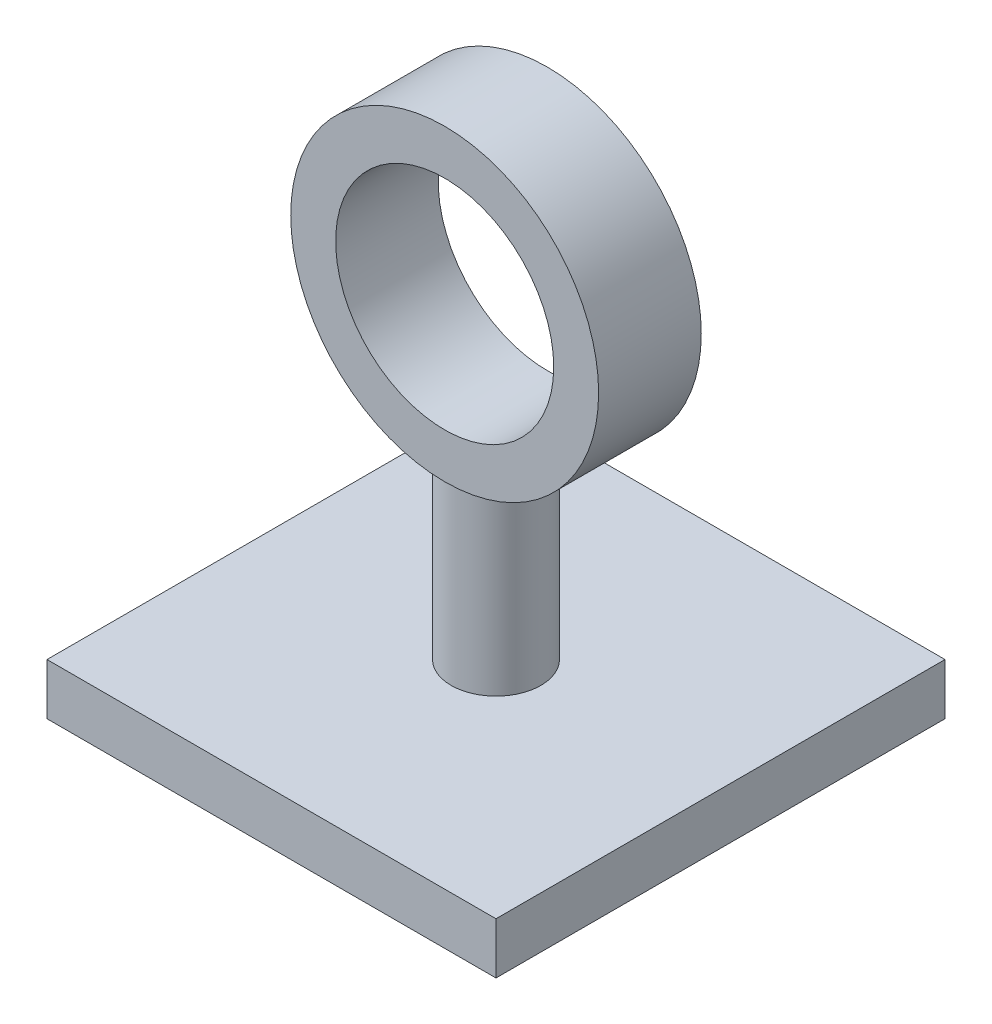
ISO-10303-21;
HEADER;
FILE_DESCRIPTION(('STEP AP214'),'2;1');
FILE_NAME('part.step','',(''),(''),'','','');
FILE_SCHEMA(('AUTOMOTIVE_DESIGN { 1 0 10303 214 1 1 1 1 }'));
ENDSEC;
DATA;
#1=APPLICATION_CONTEXT('core data for automotive mechanical design processes');
#2=APPLICATION_PROTOCOL_DEFINITION('international standard','automotive_design',2000,#1);
#3=PRODUCT_CONTEXT('',#1,'mechanical');
#4=PRODUCT('Part','Part','',(#3));
#5=PRODUCT_RELATED_PRODUCT_CATEGORY('part','',(#4));
#6=PRODUCT_DEFINITION_FORMATION('','',#4);
#7=PRODUCT_DEFINITION_CONTEXT('part definition',#1,'design');
#8=PRODUCT_DEFINITION('design','',#6,#7);
#9=PRODUCT_DEFINITION_SHAPE('','',#8);
#10=(LENGTH_UNIT() NAMED_UNIT(*) SI_UNIT(.MILLI.,.METRE.));
#11=(NAMED_UNIT(*) PLANE_ANGLE_UNIT() SI_UNIT($,.RADIAN.));
#12=(NAMED_UNIT(*) SI_UNIT($,.STERADIAN.) SOLID_ANGLE_UNIT());
#13=UNCERTAINTY_MEASURE_WITH_UNIT(LENGTH_MEASURE(1.E-05),#10,'distance_accuracy_value','');
#14=(GEOMETRIC_REPRESENTATION_CONTEXT(3) GLOBAL_UNCERTAINTY_ASSIGNED_CONTEXT((#13)) GLOBAL_UNIT_ASSIGNED_CONTEXT((#10,
#11,#12)) REPRESENTATION_CONTEXT('',''));
#15=CARTESIAN_POINT('',(0.,0.,0.));
#16=DIRECTION('',(0.,0.,1.));
#17=DIRECTION('',(1.,0.,0.));
#18=AXIS2_PLACEMENT_3D('',#15,#16,#17);
#19=CARTESIAN_POINT('',(0.,60.,-8.));
#20=DIRECTION('',(0.,0.,1.));
#21=DIRECTION('',(1.,0.,0.));
#22=AXIS2_PLACEMENT_3D('',#19,#20,#21);
#23=CYLINDRICAL_SURFACE('',#22,24.);
#24=CARTESIAN_POINT('',(0.,60.,-8.));
#25=DIRECTION('',(0.,0.,1.));
#26=DIRECTION('',(1.,0.,0.));
#27=AXIS2_PLACEMENT_3D('',#24,#25,#26);
#28=CIRCLE('',#27,24.);
#29=CARTESIAN_POINT('',(24.,60.,-8.));
#30=VERTEX_POINT('',#29);
#31=EDGE_CURVE('E11',#30,#30,#28,.T.);
#32=ORIENTED_EDGE('',*,*,#31,.T.);
#33=EDGE_LOOP('',(#32));
#34=FACE_BOUND('',#33,.T.);
#35=CARTESIAN_POINT('',(0.,60.,8.));
#36=DIRECTION('',(0.,0.,1.));
#37=DIRECTION('',(1.,0.,0.));
#38=AXIS2_PLACEMENT_3D('',#35,#36,#37);
#39=CIRCLE('',#38,24.);
#40=CARTESIAN_POINT('',(24.,60.,8.));
#41=VERTEX_POINT('',#40);
#42=EDGE_CURVE('E61',#41,#41,#39,.T.);
#43=ORIENTED_EDGE('',*,*,#42,.F.);
#44=EDGE_LOOP('',(#43));
#45=FACE_BOUND('',#44,.T.);
#46=ADVANCED_FACE('F51',(#34,#45),#23,.T.);
#47=CARTESIAN_POINT('',(0.,60.,-8.));
#48=DIRECTION('',(0.,0.,1.));
#49=DIRECTION('',(1.,0.,0.));
#50=AXIS2_PLACEMENT_3D('',#47,#48,#49);
#51=PLANE('',#50);
#52=CARTESIAN_POINT('',(0.,60.,-8.));
#53=DIRECTION('',(0.,0.,1.));
#54=DIRECTION('',(1.,0.,0.));
#55=AXIS2_PLACEMENT_3D('',#52,#53,#54);
#56=CIRCLE('',#55,17.);
#57=CARTESIAN_POINT('',(17.,60.,-8.));
#58=VERTEX_POINT('',#57);
#59=EDGE_CURVE('E57',#58,#58,#56,.T.);
#60=ORIENTED_EDGE('',*,*,#59,.T.);
#61=EDGE_LOOP('',(#60));
#62=FACE_BOUND('',#61,.T.);
#63=ORIENTED_EDGE('',*,*,#31,.F.);
#64=EDGE_LOOP('',(#63));
#65=FACE_BOUND('',#64,.T.);
#66=ADVANCED_FACE('F80',(#62,#65),#51,.F.);
#67=CARTESIAN_POINT('',(0.,60.,-8.));
#68=DIRECTION('',(0.,0.,1.));
#69=DIRECTION('',(1.,0.,0.));
#70=AXIS2_PLACEMENT_3D('',#67,#68,#69);
#71=CYLINDRICAL_SURFACE('',#70,17.);
#72=ORIENTED_EDGE('',*,*,#59,.F.);
#73=EDGE_LOOP('',(#72));
#74=FACE_BOUND('',#73,.T.);
#75=CARTESIAN_POINT('',(0.,60.,8.));
#76=DIRECTION('',(0.,0.,1.));
#77=DIRECTION('',(1.,0.,0.));
#78=AXIS2_PLACEMENT_3D('',#75,#76,#77);
#79=CIRCLE('',#78,17.);
#80=CARTESIAN_POINT('',(17.,60.,8.));
#81=VERTEX_POINT('',#80);
#82=EDGE_CURVE('E65',#81,#81,#79,.T.);
#83=ORIENTED_EDGE('',*,*,#82,.T.);
#84=EDGE_LOOP('',(#83));
#85=FACE_BOUND('',#84,.T.);
#86=ADVANCED_FACE('F71',(#74,#85),#71,.F.);
#87=CARTESIAN_POINT('',(0.,60.,8.));
#88=DIRECTION('',(0.,0.,1.));
#89=DIRECTION('',(1.,0.,0.));
#90=AXIS2_PLACEMENT_3D('',#87,#88,#89);
#91=PLANE('',#90);
#92=ORIENTED_EDGE('',*,*,#42,.T.);
#93=EDGE_LOOP('',(#92));
#94=FACE_BOUND('',#93,.T.);
#95=ORIENTED_EDGE('',*,*,#82,.F.);
#96=EDGE_LOOP('',(#95));
#97=FACE_BOUND('',#96,.T.);
#98=ADVANCED_FACE('F73',(#94,#97),#91,.T.);
#99=CLOSED_SHELL('',(#46,#66,#86,#98));
#100=MANIFOLD_SOLID_BREP('B2',#99);
#101=CARTESIAN_POINT('',(35.,8.,-35.));
#102=DIRECTION('',(-1.,0.,0.));
#103=DIRECTION('',(0.,0.,1.));
#104=AXIS2_PLACEMENT_3D('',#101,#102,#103);
#105=PLANE('',#104);
#106=DIRECTION('',(0.,0.,-1.));
#107=VECTOR('',#106,1.);
#108=CARTESIAN_POINT('',(35.,0.,-35.));
#109=LINE('',#108,#107);
#110=CARTESIAN_POINT('',(35.,0.,35.));
#111=VERTEX_POINT('',#110);
#112=CARTESIAN_POINT('',(35.,0.,-35.));
#113=VERTEX_POINT('',#112);
#114=EDGE_CURVE('E181',#111,#113,#109,.T.);
#115=ORIENTED_EDGE('',*,*,#114,.T.);
#116=DIRECTION('',(0.,-1.,0.));
#117=VECTOR('',#116,1.);
#118=CARTESIAN_POINT('',(35.,8.,-35.));
#119=LINE('',#118,#117);
#120=CARTESIAN_POINT('',(35.,8.,-35.));
#121=VERTEX_POINT('',#120);
#122=EDGE_CURVE('E49',#121,#113,#119,.T.);
#123=ORIENTED_EDGE('',*,*,#122,.F.);
#124=DIRECTION('',(0.,0.,-1.));
#125=VECTOR('',#124,1.);
#126=CARTESIAN_POINT('',(35.,8.,-35.));
#127=LINE('',#126,#125);
#128=CARTESIAN_POINT('',(35.,8.,35.));
#129=VERTEX_POINT('',#128);
#130=EDGE_CURVE('E165',#129,#121,#127,.T.);
#131=ORIENTED_EDGE('',*,*,#130,.F.);
#132=DIRECTION('',(0.,-1.,0.));
#133=VECTOR('',#132,1.);
#134=CARTESIAN_POINT('',(35.,8.,35.));
#135=LINE('',#134,#133);
#136=EDGE_CURVE('E177',#129,#111,#135,.T.);
#137=ORIENTED_EDGE('',*,*,#136,.T.);
#138=EDGE_LOOP('',(#115,#123,#131,#137));
#139=FACE_BOUND('',#138,.T.);
#140=ADVANCED_FACE('F113',(#139),#105,.F.);
#141=CARTESIAN_POINT('',(-35.,8.,-35.));
#142=DIRECTION('',(0.,0.,1.));
#143=DIRECTION('',(1.,0.,0.));
#144=AXIS2_PLACEMENT_3D('',#141,#142,#143);
#145=PLANE('',#144);
#146=DIRECTION('',(-1.,0.,0.));
#147=VECTOR('',#146,1.);
#148=CARTESIAN_POINT('',(-35.,0.,-35.));
#149=LINE('',#148,#147);
#150=CARTESIAN_POINT('',(-35.,0.,-35.));
#151=VERTEX_POINT('',#150);
#152=EDGE_CURVE('E170',#113,#151,#149,.T.);
#153=ORIENTED_EDGE('',*,*,#152,.T.);
#154=DIRECTION('',(0.,-1.,0.));
#155=VECTOR('',#154,1.);
#156=CARTESIAN_POINT('',(-35.,8.,-35.));
#157=LINE('',#156,#155);
#158=CARTESIAN_POINT('',(-35.,8.,-35.));
#159=VERTEX_POINT('',#158);
#160=EDGE_CURVE('E122',#159,#151,#157,.T.);
#161=ORIENTED_EDGE('',*,*,#160,.F.);
#162=DIRECTION('',(-1.,0.,0.));
#163=VECTOR('',#162,1.);
#164=CARTESIAN_POINT('',(-35.,8.,-35.));
#165=LINE('',#164,#163);
#166=EDGE_CURVE('E160',#121,#159,#165,.T.);
#167=ORIENTED_EDGE('',*,*,#166,.F.);
#168=ORIENTED_EDGE('',*,*,#122,.T.);
#169=EDGE_LOOP('',(#153,#161,#167,#168));
#170=FACE_BOUND('',#169,.T.);
#171=ADVANCED_FACE('F169',(#170),#145,.F.);
#172=CARTESIAN_POINT('',(-35.,8.,-35.));
#173=DIRECTION('',(1.,0.,0.));
#174=DIRECTION('',(0.,0.,-1.));
#175=AXIS2_PLACEMENT_3D('',#172,#173,#174);
#176=PLANE('',#175);
#177=DIRECTION('',(0.,0.,1.));
#178=VECTOR('',#177,1.);
#179=CARTESIAN_POINT('',(-35.,0.,-35.));
#180=LINE('',#179,#178);
#181=CARTESIAN_POINT('',(-35.,0.,35.));
#182=VERTEX_POINT('',#181);
#183=EDGE_CURVE('E147',#151,#182,#180,.T.);
#184=ORIENTED_EDGE('',*,*,#183,.T.);
#185=DIRECTION('',(0.,-1.,0.));
#186=VECTOR('',#185,1.);
#187=CARTESIAN_POINT('',(-35.,8.,35.));
#188=LINE('',#187,#186);
#189=CARTESIAN_POINT('',(-35.,8.,35.));
#190=VERTEX_POINT('',#189);
#191=EDGE_CURVE('E172',#190,#182,#188,.T.);
#192=ORIENTED_EDGE('',*,*,#191,.F.);
#193=DIRECTION('',(0.,0.,1.));
#194=VECTOR('',#193,1.);
#195=CARTESIAN_POINT('',(-35.,8.,-35.));
#196=LINE('',#195,#194);
#197=EDGE_CURVE('E163',#159,#190,#196,.T.);
#198=ORIENTED_EDGE('',*,*,#197,.F.);
#199=ORIENTED_EDGE('',*,*,#160,.T.);
#200=EDGE_LOOP('',(#184,#192,#198,#199));
#201=FACE_BOUND('',#200,.T.);
#202=ADVANCED_FACE('F173',(#201),#176,.F.);
#203=CARTESIAN_POINT('',(-35.,8.,35.));
#204=DIRECTION('',(0.,0.,-1.));
#205=DIRECTION('',(-1.,0.,0.));
#206=AXIS2_PLACEMENT_3D('',#203,#204,#205);
#207=PLANE('',#206);
#208=DIRECTION('',(1.,0.,0.));
#209=VECTOR('',#208,1.);
#210=CARTESIAN_POINT('',(-35.,0.,35.));
#211=LINE('',#210,#209);
#212=EDGE_CURVE('E153',#182,#111,#211,.T.);
#213=ORIENTED_EDGE('',*,*,#212,.T.);
#214=ORIENTED_EDGE('',*,*,#136,.F.);
#215=DIRECTION('',(1.,0.,0.));
#216=VECTOR('',#215,1.);
#217=CARTESIAN_POINT('',(-35.,8.,35.));
#218=LINE('',#217,#216);
#219=EDGE_CURVE('E130',#190,#129,#218,.T.);
#220=ORIENTED_EDGE('',*,*,#219,.F.);
#221=ORIENTED_EDGE('',*,*,#191,.T.);
#222=EDGE_LOOP('',(#213,#214,#220,#221));
#223=FACE_BOUND('',#222,.T.);
#224=ADVANCED_FACE('F195',(#223),#207,.F.);
#225=CARTESIAN_POINT('',(0.,8.,0.));
#226=DIRECTION('',(0.,1.,0.));
#227=DIRECTION('',(0.,0.,1.));
#228=AXIS2_PLACEMENT_3D('',#225,#226,#227);
#229=PLANE('',#228);
#230=CARTESIAN_POINT('',(0.,8.,0.));
#231=DIRECTION('',(0.,1.,0.));
#232=DIRECTION('',(0.,0.,1.));
#233=AXIS2_PLACEMENT_3D('',#230,#231,#232);
#234=CIRCLE('',#233,7.);
#235=CARTESIAN_POINT('',(0.,8.,7.));
#236=VERTEX_POINT('',#235);
#237=EDGE_CURVE('E185',#236,#236,#234,.F.);
#238=ORIENTED_EDGE('',*,*,#237,.T.);
#239=EDGE_LOOP('',(#238));
#240=FACE_BOUND('',#239,.T.);
#241=ORIENTED_EDGE('',*,*,#130,.T.);
#242=ORIENTED_EDGE('',*,*,#166,.T.);
#243=ORIENTED_EDGE('',*,*,#197,.T.);
#244=ORIENTED_EDGE('',*,*,#219,.T.);
#245=EDGE_LOOP('',(#241,#242,#243,#244));
#246=FACE_BOUND('',#245,.T.);
#247=ADVANCED_FACE('F161',(#240,#246),#229,.T.);
#248=CARTESIAN_POINT('',(0.,0.,0.));
#249=DIRECTION('',(0.,1.,0.));
#250=DIRECTION('',(0.,0.,1.));
#251=AXIS2_PLACEMENT_3D('',#248,#249,#250);
#252=PLANE('',#251);
#253=ORIENTED_EDGE('',*,*,#114,.F.);
#254=ORIENTED_EDGE('',*,*,#212,.F.);
#255=ORIENTED_EDGE('',*,*,#183,.F.);
#256=ORIENTED_EDGE('',*,*,#152,.F.);
#257=EDGE_LOOP('',(#253,#254,#255,#256));
#258=FACE_BOUND('',#257,.T.);
#259=ADVANCED_FACE('F198',(#258),#252,.F.);
#260=CARTESIAN_POINT('',(0.,36.,0.));
#261=DIRECTION('',(0.,-1.,0.));
#262=DIRECTION('',(0.,0.,-1.));
#263=AXIS2_PLACEMENT_3D('',#260,#261,#262);
#264=CYLINDRICAL_SURFACE('',#263,7.);
#265=ORIENTED_EDGE('',*,*,#237,.F.);
#266=EDGE_LOOP('',(#265));
#267=FACE_BOUND('',#266,.T.);
#268=CARTESIAN_POINT('',(0.,36.,0.));
#269=DIRECTION('',(0.,1.,0.));
#270=DIRECTION('',(0.,0.,1.));
#271=AXIS2_PLACEMENT_3D('',#268,#269,#270);
#272=CIRCLE('',#271,7.);
#273=CARTESIAN_POINT('',(0.,36.,7.));
#274=VERTEX_POINT('',#273);
#275=EDGE_CURVE('E205',#274,#274,#272,.T.);
#276=ORIENTED_EDGE('',*,*,#275,.F.);
#277=EDGE_LOOP('',(#276));
#278=FACE_BOUND('',#277,.T.);
#279=ADVANCED_FACE('F212',(#267,#278),#264,.T.);
#280=CARTESIAN_POINT('',(0.,36.,0.));
#281=DIRECTION('',(0.,1.,0.));
#282=DIRECTION('',(0.,0.,1.));
#283=AXIS2_PLACEMENT_3D('',#280,#281,#282);
#284=PLANE('',#283);
#285=ORIENTED_EDGE('',*,*,#275,.T.);
#286=EDGE_LOOP('',(#285));
#287=FACE_BOUND('',#286,.T.);
#288=ADVANCED_FACE('F210',(#287),#284,.T.);
#289=CLOSED_SHELL('',(#140,#171,#202,#224,#247,#259,#279,#288));
#290=MANIFOLD_SOLID_BREP('B6',#289);
#291=ADVANCED_BREP_SHAPE_REPRESENTATION('',(#18,#100,#290),#14);
#292=SHAPE_DEFINITION_REPRESENTATION(#9,#291);
ENDSEC;
END-ISO-10303-21;
